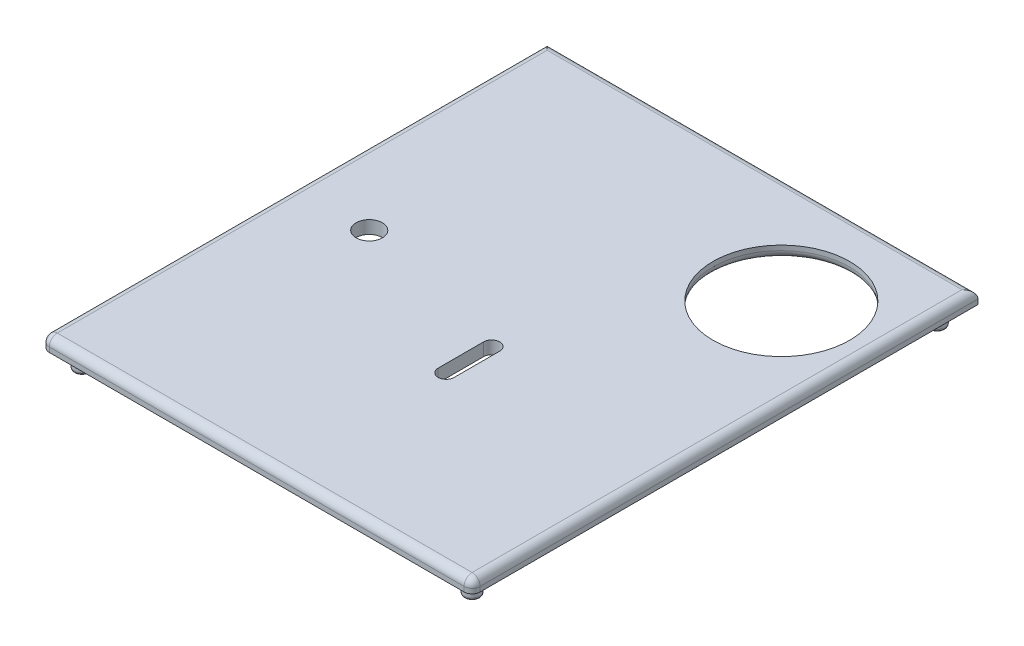
ISO-10303-21;
HEADER;
FILE_DESCRIPTION(('STEP AP214'),'2;1');
FILE_NAME('part.step','',(''),(''),'','','');
FILE_SCHEMA(('AUTOMOTIVE_DESIGN { 1 0 10303 214 1 1 1 1 }'));
ENDSEC;
DATA;
#1=APPLICATION_CONTEXT('core data for automotive mechanical design processes');
#2=APPLICATION_PROTOCOL_DEFINITION('international standard','automotive_design',2000,#1);
#3=PRODUCT_CONTEXT('',#1,'mechanical');
#4=PRODUCT('Part','Part','',(#3));
#5=PRODUCT_RELATED_PRODUCT_CATEGORY('part','',(#4));
#6=PRODUCT_DEFINITION_FORMATION('','',#4);
#7=PRODUCT_DEFINITION_CONTEXT('part definition',#1,'design');
#8=PRODUCT_DEFINITION('design','',#6,#7);
#9=PRODUCT_DEFINITION_SHAPE('','',#8);
#10=(LENGTH_UNIT() NAMED_UNIT(*) SI_UNIT(.MILLI.,.METRE.));
#11=(NAMED_UNIT(*) PLANE_ANGLE_UNIT() SI_UNIT($,.RADIAN.));
#12=(NAMED_UNIT(*) SI_UNIT($,.STERADIAN.) SOLID_ANGLE_UNIT());
#13=UNCERTAINTY_MEASURE_WITH_UNIT(LENGTH_MEASURE(1.E-05),#10,'distance_accuracy_value','');
#14=(GEOMETRIC_REPRESENTATION_CONTEXT(3) GLOBAL_UNCERTAINTY_ASSIGNED_CONTEXT((#13)) GLOBAL_UNIT_ASSIGNED_CONTEXT((#10,
#11,#12)) REPRESENTATION_CONTEXT('',''));
#15=CARTESIAN_POINT('',(0.,0.,0.));
#16=DIRECTION('',(0.,0.,1.));
#17=DIRECTION('',(1.,0.,0.));
#18=AXIS2_PLACEMENT_3D('',#15,#16,#17);
#19=CARTESIAN_POINT('',(0.,0.,0.));
#20=DIRECTION('',(0.,1.,0.));
#21=DIRECTION('',(0.,0.,1.));
#22=AXIS2_PLACEMENT_3D('',#19,#20,#21);
#23=PLANE('',#22);
#24=DIRECTION('',(0.,0.,-1.));
#25=VECTOR('',#24,1.);
#26=CARTESIAN_POINT('',(5.5,0.,0.));
#27=LINE('',#26,#25);
#28=CARTESIAN_POINT('',(5.5,0.,15.85));
#29=VERTEX_POINT('',#28);
#30=CARTESIAN_POINT('',(5.5,0.,7.35));
#31=VERTEX_POINT('',#30);
#32=EDGE_CURVE('E282',#29,#31,#27,.T.);
#33=ORIENTED_EDGE('',*,*,#32,.T.);
#34=CARTESIAN_POINT('',(4.,0.,7.35000000000001));
#35=DIRECTION('',(0.,1.,0.));
#36=DIRECTION('',(0.,0.,1.));
#37=AXIS2_PLACEMENT_3D('',#34,#35,#36);
#38=CIRCLE('',#37,1.5);
#39=CARTESIAN_POINT('',(2.5,0.,7.35));
#40=VERTEX_POINT('',#39);
#41=EDGE_CURVE('E92',#31,#40,#38,.T.);
#42=ORIENTED_EDGE('',*,*,#41,.T.);
#43=DIRECTION('',(0.,0.,1.));
#44=VECTOR('',#43,1.);
#45=CARTESIAN_POINT('',(2.5,0.,0.));
#46=LINE('',#45,#44);
#47=CARTESIAN_POINT('',(2.5,0.,15.85));
#48=VERTEX_POINT('',#47);
#49=EDGE_CURVE('E292',#40,#48,#46,.T.);
#50=ORIENTED_EDGE('',*,*,#49,.T.);
#51=CARTESIAN_POINT('',(4.,0.,15.85));
#52=DIRECTION('',(0.,1.,0.));
#53=DIRECTION('',(0.,0.,1.));
#54=AXIS2_PLACEMENT_3D('',#51,#52,#53);
#55=CIRCLE('',#54,1.5);
#56=EDGE_CURVE('E296',#48,#29,#55,.T.);
#57=ORIENTED_EDGE('',*,*,#56,.T.);
#58=EDGE_LOOP('',(#33,#42,#50,#57));
#59=FACE_BOUND('',#58,.T.);
#60=CARTESIAN_POINT('',(36.4,0.,43.4));
#61=DIRECTION('',(0.,1.,0.));
#62=DIRECTION('',(0.,0.,1.));
#63=AXIS2_PLACEMENT_3D('',#60,#61,#62);
#64=CIRCLE('',#63,1.45);
#65=CARTESIAN_POINT('',(36.4,0.,44.85));
#66=VERTEX_POINT('',#65);
#67=EDGE_CURVE('E309',#66,#66,#64,.T.);
#68=ORIENTED_EDGE('',*,*,#67,.T.);
#69=EDGE_LOOP('',(#68));
#70=FACE_BOUND('',#69,.T.);
#71=CARTESIAN_POINT('',(-36.4,0.,43.4));
#72=DIRECTION('',(0.,1.,0.));
#73=DIRECTION('',(0.,0.,1.));
#74=AXIS2_PLACEMENT_3D('',#71,#72,#73);
#75=CIRCLE('',#74,1.45);
#76=CARTESIAN_POINT('',(-36.4,0.,44.85));
#77=VERTEX_POINT('',#76);
#78=EDGE_CURVE('E313',#77,#77,#75,.T.);
#79=ORIENTED_EDGE('',*,*,#78,.T.);
#80=EDGE_LOOP('',(#79));
#81=FACE_BOUND('',#80,.T.);
#82=CARTESIAN_POINT('',(-36.4,0.,-43.4));
#83=DIRECTION('',(0.,1.,0.));
#84=DIRECTION('',(0.,0.,1.));
#85=AXIS2_PLACEMENT_3D('',#82,#83,#84);
#86=CIRCLE('',#85,1.45);
#87=CARTESIAN_POINT('',(-36.4,0.,-41.95));
#88=VERTEX_POINT('',#87);
#89=EDGE_CURVE('E317',#88,#88,#86,.T.);
#90=ORIENTED_EDGE('',*,*,#89,.T.);
#91=EDGE_LOOP('',(#90));
#92=FACE_BOUND('',#91,.T.);
#93=CARTESIAN_POINT('',(36.4,0.,-43.4));
#94=DIRECTION('',(0.,1.,0.));
#95=DIRECTION('',(0.,0.,1.));
#96=AXIS2_PLACEMENT_3D('',#93,#94,#95);
#97=CIRCLE('',#96,1.45);
#98=CARTESIAN_POINT('',(36.4,0.,-41.95));
#99=VERTEX_POINT('',#98);
#100=EDGE_CURVE('E321',#99,#99,#97,.T.);
#101=ORIENTED_EDGE('',*,*,#100,.T.);
#102=EDGE_LOOP('',(#101));
#103=FACE_BOUND('',#102,.T.);
#104=DIRECTION('',(0.,0.,1.));
#105=VECTOR('',#104,1.);
#106=CARTESIAN_POINT('',(37.9,0.,4.20000000000001));
#107=LINE('',#106,#105);
#108=CARTESIAN_POINT('',(37.9,0.,-7.79999999999999));
#109=VERTEX_POINT('',#108);
#110=CARTESIAN_POINT('',(37.9,0.,4.20000000000001));
#111=VERTEX_POINT('',#110);
#112=EDGE_CURVE('E357',#109,#111,#107,.T.);
#113=ORIENTED_EDGE('',*,*,#112,.F.);
#114=DIRECTION('',(1.,0.,0.));
#115=VECTOR('',#114,1.);
#116=CARTESIAN_POINT('',(35.9,0.,-7.79999999999999));
#117=LINE('',#116,#115);
#118=CARTESIAN_POINT('',(35.9,0.,-7.79999999999999));
#119=VERTEX_POINT('',#118);
#120=EDGE_CURVE('E220',#119,#109,#117,.T.);
#121=ORIENTED_EDGE('',*,*,#120,.F.);
#122=DIRECTION('',(0.,0.,-1.));
#123=VECTOR('',#122,1.);
#124=CARTESIAN_POINT('',(35.9,0.,4.20000000000001));
#125=LINE('',#124,#123);
#126=CARTESIAN_POINT('',(35.9,0.,4.20000000000001));
#127=VERTEX_POINT('',#126);
#128=EDGE_CURVE('E381',#127,#119,#125,.T.);
#129=ORIENTED_EDGE('',*,*,#128,.F.);
#130=DIRECTION('',(-1.,0.,0.));
#131=VECTOR('',#130,1.);
#132=CARTESIAN_POINT('',(35.9,0.,4.20000000000001));
#133=LINE('',#132,#131);
#134=EDGE_CURVE('E377',#111,#127,#133,.T.);
#135=ORIENTED_EDGE('',*,*,#134,.F.);
#136=EDGE_LOOP('',(#113,#121,#129,#135));
#137=FACE_BOUND('',#136,.T.);
#138=CARTESIAN_POINT('',(23.65,0.,-27.05));
#139=DIRECTION('',(0.,1.,0.));
#140=DIRECTION('',(0.,0.,1.));
#141=AXIS2_PLACEMENT_3D('',#138,#139,#140);
#142=CIRCLE('',#141,14.25);
#143=CARTESIAN_POINT('',(23.65,0.,-12.8));
#144=VERTEX_POINT('',#143);
#145=EDGE_CURVE('E441',#144,#144,#142,.T.);
#146=ORIENTED_EDGE('',*,*,#145,.T.);
#147=EDGE_LOOP('',(#146));
#148=FACE_BOUND('',#147,.T.);
#149=CARTESIAN_POINT('',(-26.2,0.,0.));
#150=DIRECTION('',(0.,1.,0.));
#151=DIRECTION('',(0.,0.,1.));
#152=AXIS2_PLACEMENT_3D('',#149,#150,#151);
#153=CIRCLE('',#152,2.45);
#154=CARTESIAN_POINT('',(-26.2,0.,2.45));
#155=VERTEX_POINT('',#154);
#156=EDGE_CURVE('E406',#155,#155,#153,.T.);
#157=ORIENTED_EDGE('',*,*,#156,.T.);
#158=EDGE_LOOP('',(#157));
#159=FACE_BOUND('',#158,.T.);
#160=DIRECTION('',(0.,0.,-1.));
#161=VECTOR('',#160,1.);
#162=CARTESIAN_POINT('',(40.2,0.,0.));
#163=LINE('',#162,#161);
#164=CARTESIAN_POINT('',(40.2,0.,45.7));
#165=VERTEX_POINT('',#164);
#166=CARTESIAN_POINT('',(40.2,0.,-47.2));
#167=VERTEX_POINT('',#166);
#168=EDGE_CURVE('E415',#165,#167,#163,.T.);
#169=ORIENTED_EDGE('',*,*,#168,.F.);
#170=CARTESIAN_POINT('',(38.7,0.,45.7));
#171=DIRECTION('',(0.,1.,0.));
#172=DIRECTION('',(0.,0.,1.));
#173=AXIS2_PLACEMENT_3D('',#170,#171,#172);
#174=CIRCLE('',#173,1.5);
#175=CARTESIAN_POINT('',(38.7,0.,47.2));
#176=VERTEX_POINT('',#175);
#177=EDGE_CURVE('E445',#165,#176,#174,.F.);
#178=ORIENTED_EDGE('',*,*,#177,.T.);
#179=DIRECTION('',(1.,0.,0.));
#180=VECTOR('',#179,1.);
#181=CARTESIAN_POINT('',(0.,0.,47.2));
#182=LINE('',#181,#180);
#183=CARTESIAN_POINT('',(-38.7,0.,47.2));
#184=VERTEX_POINT('',#183);
#185=EDGE_CURVE('E410',#184,#176,#182,.T.);
#186=ORIENTED_EDGE('',*,*,#185,.F.);
#187=CARTESIAN_POINT('',(-38.7,0.,45.7));
#188=DIRECTION('',(0.,1.,0.));
#189=DIRECTION('',(0.,0.,1.));
#190=AXIS2_PLACEMENT_3D('',#187,#188,#189);
#191=CIRCLE('',#190,1.5);
#192=CARTESIAN_POINT('',(-40.2,0.,45.7));
#193=VERTEX_POINT('',#192);
#194=EDGE_CURVE('E438',#184,#193,#191,.F.);
#195=ORIENTED_EDGE('',*,*,#194,.T.);
#196=DIRECTION('',(0.,0.,-1.));
#197=VECTOR('',#196,1.);
#198=CARTESIAN_POINT('',(-40.2,0.,0.));
#199=LINE('',#198,#197);
#200=CARTESIAN_POINT('',(-40.2,0.,-47.2));
#201=VERTEX_POINT('',#200);
#202=EDGE_CURVE('E401',#193,#201,#199,.T.);
#203=ORIENTED_EDGE('',*,*,#202,.T.);
#204=DIRECTION('',(1.,0.,0.));
#205=VECTOR('',#204,1.);
#206=CARTESIAN_POINT('',(0.,0.,-47.2));
#207=LINE('',#206,#205);
#208=EDGE_CURVE('E419',#201,#167,#207,.T.);
#209=ORIENTED_EDGE('',*,*,#208,.T.);
#210=EDGE_LOOP('',(#169,#178,#186,#195,#203,#209));
#211=FACE_BOUND('',#210,.T.);
#212=DIRECTION('',(0.,0.,1.));
#213=VECTOR('',#212,1.);
#214=CARTESIAN_POINT('',(-35.9,0.,4.20000000000001));
#215=LINE('',#214,#213);
#216=CARTESIAN_POINT('',(-35.9,0.,-7.79999999999999));
#217=VERTEX_POINT('',#216);
#218=CARTESIAN_POINT('',(-35.9,0.,4.20000000000001));
#219=VERTEX_POINT('',#218);
#220=EDGE_CURVE('E353',#217,#219,#215,.T.);
#221=ORIENTED_EDGE('',*,*,#220,.F.);
#222=DIRECTION('',(1.,0.,0.));
#223=VECTOR('',#222,1.);
#224=CARTESIAN_POINT('',(-35.9,0.,-7.79999999999999));
#225=LINE('',#224,#223);
#226=CARTESIAN_POINT('',(-37.9,0.,-7.79999999999999));
#227=VERTEX_POINT('',#226);
#228=EDGE_CURVE('E340',#227,#217,#225,.T.);
#229=ORIENTED_EDGE('',*,*,#228,.F.);
#230=DIRECTION('',(0.,0.,-1.));
#231=VECTOR('',#230,1.);
#232=CARTESIAN_POINT('',(-37.9,0.,4.20000000000001));
#233=LINE('',#232,#231);
#234=CARTESIAN_POINT('',(-37.9,0.,4.20000000000001));
#235=VERTEX_POINT('',#234);
#236=EDGE_CURVE('E344',#235,#227,#233,.T.);
#237=ORIENTED_EDGE('',*,*,#236,.F.);
#238=DIRECTION('',(-1.,0.,0.));
#239=VECTOR('',#238,1.);
#240=CARTESIAN_POINT('',(-35.9,0.,4.20000000000001));
#241=LINE('',#240,#239);
#242=EDGE_CURVE('E349',#219,#235,#241,.T.);
#243=ORIENTED_EDGE('',*,*,#242,.F.);
#244=EDGE_LOOP('',(#221,#229,#237,#243));
#245=FACE_BOUND('',#244,.T.);
#246=ADVANCED_FACE('F45',(#59,#70,#81,#92,#103,#137,#148,#159,#211,#245),#23,.F.);
#247=CARTESIAN_POINT('',(0.,2.4,47.2));
#248=DIRECTION('',(0.,0.,-1.));
#249=DIRECTION('',(-1.,0.,0.));
#250=AXIS2_PLACEMENT_3D('',#247,#248,#249);
#251=PLANE('',#250);
#252=ORIENTED_EDGE('',*,*,#185,.T.);
#253=DIRECTION('',(0.,-1.,0.));
#254=VECTOR('',#253,1.);
#255=CARTESIAN_POINT('',(38.7,2.4,47.2));
#256=LINE('',#255,#254);
#257=CARTESIAN_POINT('',(38.7,0.9,47.2));
#258=VERTEX_POINT('',#257);
#259=EDGE_CURVE('E454',#176,#258,#256,.F.);
#260=ORIENTED_EDGE('',*,*,#259,.T.);
#261=DIRECTION('',(1.,0.,0.));
#262=VECTOR('',#261,1.);
#263=CARTESIAN_POINT('',(-40.2,0.9,47.2));
#264=LINE('',#263,#262);
#265=CARTESIAN_POINT('',(-38.7,0.9,47.2));
#266=VERTEX_POINT('',#265);
#267=EDGE_CURVE('E448',#258,#266,#264,.F.);
#268=ORIENTED_EDGE('',*,*,#267,.T.);
#269=DIRECTION('',(0.,-1.,0.));
#270=VECTOR('',#269,1.);
#271=CARTESIAN_POINT('',(-38.7,0.,47.2));
#272=LINE('',#271,#270);
#273=EDGE_CURVE('E451',#266,#184,#272,.T.);
#274=ORIENTED_EDGE('',*,*,#273,.T.);
#275=EDGE_LOOP('',(#252,#260,#268,#274));
#276=FACE_BOUND('',#275,.T.);
#277=ADVANCED_FACE('F539',(#276),#251,.F.);
#278=CARTESIAN_POINT('',(40.2,2.4,0.));
#279=DIRECTION('',(-1.,0.,0.));
#280=DIRECTION('',(0.,0.,1.));
#281=AXIS2_PLACEMENT_3D('',#278,#279,#280);
#282=PLANE('',#281);
#283=DIRECTION('',(0.,0.,-1.));
#284=VECTOR('',#283,1.);
#285=CARTESIAN_POINT('',(40.2,0.9,47.2));
#286=LINE('',#285,#284);
#287=CARTESIAN_POINT('',(40.2,0.9,-47.2));
#288=VERTEX_POINT('',#287);
#289=CARTESIAN_POINT('',(40.2,0.9,45.7));
#290=VERTEX_POINT('',#289);
#291=EDGE_CURVE('E431',#288,#290,#286,.F.);
#292=ORIENTED_EDGE('',*,*,#291,.T.);
#293=DIRECTION('',(0.,-1.,0.));
#294=VECTOR('',#293,1.);
#295=CARTESIAN_POINT('',(40.2,2.4,45.7));
#296=LINE('',#295,#294);
#297=EDGE_CURVE('E434',#290,#165,#296,.T.);
#298=ORIENTED_EDGE('',*,*,#297,.T.);
#299=ORIENTED_EDGE('',*,*,#168,.T.);
#300=DIRECTION('',(0.,-1.,0.));
#301=VECTOR('',#300,1.);
#302=CARTESIAN_POINT('',(40.2,2.4,-47.2));
#303=LINE('',#302,#301);
#304=EDGE_CURVE('E428',#288,#167,#303,.T.);
#305=ORIENTED_EDGE('',*,*,#304,.F.);
#306=EDGE_LOOP('',(#292,#298,#299,#305));
#307=FACE_BOUND('',#306,.T.);
#308=ADVANCED_FACE('F608',(#307),#282,.F.);
#309=CARTESIAN_POINT('',(0.,2.4,-47.2));
#310=DIRECTION('',(0.,0.,-1.));
#311=DIRECTION('',(-1.,0.,0.));
#312=AXIS2_PLACEMENT_3D('',#309,#310,#311);
#313=PLANE('',#312);
#314=DIRECTION('',(0.,-1.,0.));
#315=VECTOR('',#314,1.);
#316=CARTESIAN_POINT('',(-40.2,2.4,-47.2));
#317=LINE('',#316,#315);
#318=CARTESIAN_POINT('',(-40.2,0.9,-47.2));
#319=VERTEX_POINT('',#318);
#320=EDGE_CURVE('E405',#319,#201,#317,.T.);
#321=ORIENTED_EDGE('',*,*,#320,.F.);
#322=DIRECTION('',(1.,0.,0.));
#323=VECTOR('',#322,1.);
#324=CARTESIAN_POINT('',(0.,0.9,-47.2));
#325=LINE('',#324,#323);
#326=EDGE_CURVE('E474',#319,#288,#325,.T.);
#327=ORIENTED_EDGE('',*,*,#326,.T.);
#328=ORIENTED_EDGE('',*,*,#304,.T.);
#329=ORIENTED_EDGE('',*,*,#208,.F.);
#330=EDGE_LOOP('',(#321,#327,#328,#329));
#331=FACE_BOUND('',#330,.T.);
#332=ADVANCED_FACE('F604',(#331),#313,.T.);
#333=CARTESIAN_POINT('',(23.65,2.4,-27.05));
#334=DIRECTION('',(0.,-1.,0.));
#335=DIRECTION('',(0.,0.,-1.));
#336=AXIS2_PLACEMENT_3D('',#333,#334,#335);
#337=CYLINDRICAL_SURFACE('',#336,12.75);
#338=CARTESIAN_POINT('',(23.65,1.5,-27.05));
#339=DIRECTION('',(0.,1.,0.));
#340=DIRECTION('',(0.,0.,1.));
#341=AXIS2_PLACEMENT_3D('',#338,#339,#340);
#342=CIRCLE('',#341,12.75);
#343=CARTESIAN_POINT('',(23.65,1.5,-14.3));
#344=VERTEX_POINT('',#343);
#345=EDGE_CURVE('E457',#344,#344,#342,.F.);
#346=ORIENTED_EDGE('',*,*,#345,.T.);
#347=EDGE_LOOP('',(#346));
#348=FACE_BOUND('',#347,.T.);
#349=CARTESIAN_POINT('',(23.65,2.4,-27.05));
#350=DIRECTION('',(0.,1.,0.));
#351=DIRECTION('',(0.,0.,1.));
#352=AXIS2_PLACEMENT_3D('',#349,#350,#351);
#353=CIRCLE('',#352,12.75);
#354=CARTESIAN_POINT('',(23.65,2.4,-14.3));
#355=VERTEX_POINT('',#354);
#356=EDGE_CURVE('E400',#355,#355,#353,.T.);
#357=ORIENTED_EDGE('',*,*,#356,.T.);
#358=EDGE_LOOP('',(#357));
#359=FACE_BOUND('',#358,.T.);
#360=ADVANCED_FACE('F607',(#348,#359),#337,.F.);
#361=CARTESIAN_POINT('',(-26.2,2.4,0.));
#362=DIRECTION('',(0.,-1.,0.));
#363=DIRECTION('',(0.,0.,-1.));
#364=AXIS2_PLACEMENT_3D('',#361,#362,#363);
#365=CYLINDRICAL_SURFACE('',#364,2.45);
#366=CARTESIAN_POINT('',(-26.2,2.4,0.));
#367=DIRECTION('',(0.,1.,0.));
#368=DIRECTION('',(0.,0.,1.));
#369=AXIS2_PLACEMENT_3D('',#366,#367,#368);
#370=CIRCLE('',#369,2.45);
#371=CARTESIAN_POINT('',(-26.2,2.4,2.45));
#372=VERTEX_POINT('',#371);
#373=EDGE_CURVE('E396',#372,#372,#370,.T.);
#374=ORIENTED_EDGE('',*,*,#373,.T.);
#375=EDGE_LOOP('',(#374));
#376=FACE_BOUND('',#375,.T.);
#377=ORIENTED_EDGE('',*,*,#156,.F.);
#378=EDGE_LOOP('',(#377));
#379=FACE_BOUND('',#378,.T.);
#380=ADVANCED_FACE('F602',(#376,#379),#365,.F.);
#381=CARTESIAN_POINT('',(-40.2,2.4,0.));
#382=DIRECTION('',(-1.,0.,0.));
#383=DIRECTION('',(0.,0.,1.));
#384=AXIS2_PLACEMENT_3D('',#381,#382,#383);
#385=PLANE('',#384);
#386=ORIENTED_EDGE('',*,*,#202,.F.);
#387=DIRECTION('',(0.,-1.,0.));
#388=VECTOR('',#387,1.);
#389=CARTESIAN_POINT('',(-40.2,2.4,45.7));
#390=LINE('',#389,#388);
#391=CARTESIAN_POINT('',(-40.2,0.9,45.7));
#392=VERTEX_POINT('',#391);
#393=EDGE_CURVE('E480',#193,#392,#390,.F.);
#394=ORIENTED_EDGE('',*,*,#393,.T.);
#395=DIRECTION('',(0.,0.,-1.));
#396=VECTOR('',#395,1.);
#397=CARTESIAN_POINT('',(-40.2,0.9,0.));
#398=LINE('',#397,#396);
#399=EDGE_CURVE('E477',#392,#319,#398,.T.);
#400=ORIENTED_EDGE('',*,*,#399,.T.);
#401=ORIENTED_EDGE('',*,*,#320,.T.);
#402=EDGE_LOOP('',(#386,#394,#400,#401));
#403=FACE_BOUND('',#402,.T.);
#404=ADVANCED_FACE('F598',(#403),#385,.T.);
#405=CARTESIAN_POINT('',(0.,2.4,0.));
#406=DIRECTION('',(0.,1.,0.));
#407=DIRECTION('',(0.,0.,1.));
#408=AXIS2_PLACEMENT_3D('',#405,#406,#407);
#409=PLANE('',#408);
#410=CARTESIAN_POINT('',(4.,2.4,7.35000000000001));
#411=DIRECTION('',(0.,1.,0.));
#412=DIRECTION('',(0.,0.,1.));
#413=AXIS2_PLACEMENT_3D('',#410,#411,#412);
#414=CIRCLE('',#413,1.5);
#415=CARTESIAN_POINT('',(5.5,2.4,7.35));
#416=VERTEX_POINT('',#415);
#417=CARTESIAN_POINT('',(2.5,2.4,7.35000000000001));
#418=VERTEX_POINT('',#417);
#419=EDGE_CURVE('E11',#416,#418,#414,.T.);
#420=ORIENTED_EDGE('',*,*,#419,.F.);
#421=DIRECTION('',(0.,0.,-1.));
#422=VECTOR('',#421,1.);
#423=CARTESIAN_POINT('',(5.5,2.4,7.35));
#424=LINE('',#423,#422);
#425=CARTESIAN_POINT('',(5.5,2.4,15.85));
#426=VERTEX_POINT('',#425);
#427=EDGE_CURVE('E55',#426,#416,#424,.T.);
#428=ORIENTED_EDGE('',*,*,#427,.F.);
#429=CARTESIAN_POINT('',(4.,2.4,15.85));
#430=DIRECTION('',(0.,1.,0.));
#431=DIRECTION('',(0.,0.,1.));
#432=AXIS2_PLACEMENT_3D('',#429,#430,#431);
#433=CIRCLE('',#432,1.5);
#434=CARTESIAN_POINT('',(2.5,2.4,15.85));
#435=VERTEX_POINT('',#434);
#436=EDGE_CURVE('E268',#435,#426,#433,.T.);
#437=ORIENTED_EDGE('',*,*,#436,.F.);
#438=DIRECTION('',(0.,0.,1.));
#439=VECTOR('',#438,1.);
#440=CARTESIAN_POINT('',(2.5,2.4,7.35));
#441=LINE('',#440,#439);
#442=EDGE_CURVE('E265',#418,#435,#441,.T.);
#443=ORIENTED_EDGE('',*,*,#442,.F.);
#444=EDGE_LOOP('',(#420,#428,#437,#443));
#445=FACE_BOUND('',#444,.T.);
#446=DIRECTION('',(1.,0.,0.));
#447=VECTOR('',#446,1.);
#448=CARTESIAN_POINT('',(40.2,2.4,45.7));
#449=LINE('',#448,#447);
#450=CARTESIAN_POINT('',(-38.7,2.4,45.7));
#451=VERTEX_POINT('',#450);
#452=CARTESIAN_POINT('',(38.7,2.4,45.7));
#453=VERTEX_POINT('',#452);
#454=EDGE_CURVE('E461',#451,#453,#449,.T.);
#455=ORIENTED_EDGE('',*,*,#454,.T.);
#456=DIRECTION('',(0.,0.,-1.));
#457=VECTOR('',#456,1.);
#458=CARTESIAN_POINT('',(38.7,2.4,-47.2));
#459=LINE('',#458,#457);
#460=CARTESIAN_POINT('',(38.7,2.4,-45.7));
#461=VERTEX_POINT('',#460);
#462=EDGE_CURVE('E470',#453,#461,#459,.T.);
#463=ORIENTED_EDGE('',*,*,#462,.T.);
#464=DIRECTION('',(1.,0.,0.));
#465=VECTOR('',#464,1.);
#466=CARTESIAN_POINT('',(0.,2.4,-45.7));
#467=LINE('',#466,#465);
#468=CARTESIAN_POINT('',(-38.7,2.4,-45.7));
#469=VERTEX_POINT('',#468);
#470=EDGE_CURVE('E467',#461,#469,#467,.F.);
#471=ORIENTED_EDGE('',*,*,#470,.T.);
#472=DIRECTION('',(0.,0.,-1.));
#473=VECTOR('',#472,1.);
#474=CARTESIAN_POINT('',(-38.7,2.4,0.));
#475=LINE('',#474,#473);
#476=EDGE_CURVE('E464',#469,#451,#475,.F.);
#477=ORIENTED_EDGE('',*,*,#476,.T.);
#478=EDGE_LOOP('',(#455,#463,#471,#477));
#479=FACE_BOUND('',#478,.T.);
#480=ORIENTED_EDGE('',*,*,#373,.F.);
#481=EDGE_LOOP('',(#480));
#482=FACE_BOUND('',#481,.T.);
#483=ORIENTED_EDGE('',*,*,#356,.F.);
#484=EDGE_LOOP('',(#483));
#485=FACE_BOUND('',#484,.T.);
#486=ADVANCED_FACE('F287',(#445,#479,#482,#485),#409,.T.);
#487=CARTESIAN_POINT('',(-38.7,2.4,45.7));
#488=DIRECTION('',(0.,1.,0.));
#489=DIRECTION('',(0.,0.,1.));
#490=AXIS2_PLACEMENT_3D('',#487,#488,#489);
#491=CYLINDRICAL_SURFACE('',#490,1.5);
#492=ORIENTED_EDGE('',*,*,#194,.F.);
#493=ORIENTED_EDGE('',*,*,#273,.F.);
#494=CARTESIAN_POINT('',(-38.7,0.9,45.7));
#495=DIRECTION('',(0.,1.,0.));
#496=DIRECTION('',(0.,0.,1.));
#497=AXIS2_PLACEMENT_3D('',#494,#495,#496);
#498=CIRCLE('',#497,1.5);
#499=EDGE_CURVE('E411',#392,#266,#498,.T.);
#500=ORIENTED_EDGE('',*,*,#499,.F.);
#501=ORIENTED_EDGE('',*,*,#393,.F.);
#502=EDGE_LOOP('',(#492,#493,#500,#501));
#503=FACE_BOUND('',#502,.T.);
#504=ADVANCED_FACE('F597',(#503),#491,.T.);
#505=CARTESIAN_POINT('',(-38.7,0.9,0.));
#506=DIRECTION('',(0.,0.,-1.));
#507=DIRECTION('',(-1.,0.,0.));
#508=AXIS2_PLACEMENT_3D('',#505,#506,#507);
#509=CYLINDRICAL_SURFACE('',#508,1.5);
#510=CARTESIAN_POINT('',(-38.7,0.9,-45.7));
#511=DIRECTION('',(0.707106781186547,0.,-0.707106781186547));
#512=DIRECTION('',(-0.707106781186547,0.,-0.707106781186547));
#513=AXIS2_PLACEMENT_3D('',#510,#511,#512);
#514=ELLIPSE('',#513,2.12132034355964,1.5);
#515=EDGE_CURVE('E502',#319,#469,#514,.T.);
#516=ORIENTED_EDGE('',*,*,#515,.F.);
#517=ORIENTED_EDGE('',*,*,#399,.F.);
#518=CARTESIAN_POINT('',(-38.7,0.9,45.7));
#519=DIRECTION('',(0.,0.,1.));
#520=DIRECTION('',(1.,0.,0.));
#521=AXIS2_PLACEMENT_3D('',#518,#519,#520);
#522=CIRCLE('',#521,1.5);
#523=EDGE_CURVE('E506',#451,#392,#522,.T.);
#524=ORIENTED_EDGE('',*,*,#523,.F.);
#525=ORIENTED_EDGE('',*,*,#476,.F.);
#526=EDGE_LOOP('',(#516,#517,#524,#525));
#527=FACE_BOUND('',#526,.T.);
#528=ADVANCED_FACE('F645',(#527),#509,.T.);
#529=CARTESIAN_POINT('',(-38.7,0.9,45.7));
#530=DIRECTION('',(-1.,0.,0.));
#531=DIRECTION('',(0.,0.,1.));
#532=AXIS2_PLACEMENT_3D('',#529,#530,#531);
#533=SPHERICAL_SURFACE('',#532,1.5);
#534=ORIENTED_EDGE('',*,*,#523,.T.);
#535=ORIENTED_EDGE('',*,*,#499,.T.);
#536=CARTESIAN_POINT('',(-38.7,0.9,45.7));
#537=DIRECTION('',(-1.,0.,0.));
#538=DIRECTION('',(0.,0.,1.));
#539=AXIS2_PLACEMENT_3D('',#536,#537,#538);
#540=CIRCLE('',#539,1.5);
#541=EDGE_CURVE('E498',#451,#266,#540,.F.);
#542=ORIENTED_EDGE('',*,*,#541,.F.);
#543=EDGE_LOOP('',(#534,#535,#542));
#544=FACE_BOUND('',#543,.T.);
#545=ADVANCED_FACE('F641',(#544),#533,.T.);
#546=CARTESIAN_POINT('',(0.,0.9,-45.7));
#547=DIRECTION('',(1.,0.,0.));
#548=DIRECTION('',(0.,0.,-1.));
#549=AXIS2_PLACEMENT_3D('',#546,#547,#548);
#550=CYLINDRICAL_SURFACE('',#549,1.5);
#551=ORIENTED_EDGE('',*,*,#515,.T.);
#552=ORIENTED_EDGE('',*,*,#470,.F.);
#553=CARTESIAN_POINT('',(38.7,0.9,-45.7));
#554=DIRECTION('',(0.707106781186547,0.,0.707106781186547));
#555=DIRECTION('',(0.707106781186547,0.,-0.707106781186547));
#556=AXIS2_PLACEMENT_3D('',#553,#554,#555);
#557=ELLIPSE('',#556,2.12132034355964,1.5);
#558=EDGE_CURVE('E495',#288,#461,#557,.T.);
#559=ORIENTED_EDGE('',*,*,#558,.F.);
#560=ORIENTED_EDGE('',*,*,#326,.F.);
#561=EDGE_LOOP('',(#551,#552,#559,#560));
#562=FACE_BOUND('',#561,.T.);
#563=ADVANCED_FACE('F637',(#562),#550,.T.);
#564=CARTESIAN_POINT('',(0.,0.9,45.7));
#565=DIRECTION('',(-1.,0.,0.));
#566=DIRECTION('',(0.,0.,1.));
#567=AXIS2_PLACEMENT_3D('',#564,#565,#566);
#568=CYLINDRICAL_SURFACE('',#567,1.5);
#569=ORIENTED_EDGE('',*,*,#541,.T.);
#570=ORIENTED_EDGE('',*,*,#267,.F.);
#571=CARTESIAN_POINT('',(38.7,0.9,45.7));
#572=DIRECTION('',(1.,0.,0.));
#573=DIRECTION('',(0.,0.,-1.));
#574=AXIS2_PLACEMENT_3D('',#571,#572,#573);
#575=CIRCLE('',#574,1.5);
#576=EDGE_CURVE('E491',#453,#258,#575,.T.);
#577=ORIENTED_EDGE('',*,*,#576,.F.);
#578=ORIENTED_EDGE('',*,*,#454,.F.);
#579=EDGE_LOOP('',(#569,#570,#577,#578));
#580=FACE_BOUND('',#579,.T.);
#581=ADVANCED_FACE('F633',(#580),#568,.T.);
#582=CARTESIAN_POINT('',(38.7,0.9,0.));
#583=DIRECTION('',(0.,0.,1.));
#584=DIRECTION('',(1.,0.,0.));
#585=AXIS2_PLACEMENT_3D('',#582,#583,#584);
#586=CYLINDRICAL_SURFACE('',#585,1.5);
#587=ORIENTED_EDGE('',*,*,#558,.T.);
#588=ORIENTED_EDGE('',*,*,#462,.F.);
#589=CARTESIAN_POINT('',(38.7,0.9,45.7));
#590=DIRECTION('',(0.,0.,1.));
#591=DIRECTION('',(1.,0.,0.));
#592=AXIS2_PLACEMENT_3D('',#589,#590,#591);
#593=CIRCLE('',#592,1.5);
#594=EDGE_CURVE('E487',#290,#453,#593,.T.);
#595=ORIENTED_EDGE('',*,*,#594,.F.);
#596=ORIENTED_EDGE('',*,*,#291,.F.);
#597=EDGE_LOOP('',(#587,#588,#595,#596));
#598=FACE_BOUND('',#597,.T.);
#599=ADVANCED_FACE('F629',(#598),#586,.T.);
#600=CARTESIAN_POINT('',(38.7,0.9,45.7));
#601=DIRECTION('',(0.,1.,0.));
#602=DIRECTION('',(0.,0.,1.));
#603=AXIS2_PLACEMENT_3D('',#600,#601,#602);
#604=SPHERICAL_SURFACE('',#603,1.5);
#605=ORIENTED_EDGE('',*,*,#594,.T.);
#606=ORIENTED_EDGE('',*,*,#576,.T.);
#607=CARTESIAN_POINT('',(38.7,0.9,45.7));
#608=DIRECTION('',(0.,1.,0.));
#609=DIRECTION('',(0.,0.,1.));
#610=AXIS2_PLACEMENT_3D('',#607,#608,#609);
#611=CIRCLE('',#610,1.5);
#612=EDGE_CURVE('E395',#290,#258,#611,.F.);
#613=ORIENTED_EDGE('',*,*,#612,.F.);
#614=EDGE_LOOP('',(#605,#606,#613));
#615=FACE_BOUND('',#614,.T.);
#616=ADVANCED_FACE('F625',(#615),#604,.T.);
#617=CARTESIAN_POINT('',(38.7,2.4,45.7));
#618=DIRECTION('',(0.,-1.,0.));
#619=DIRECTION('',(0.,0.,-1.));
#620=AXIS2_PLACEMENT_3D('',#617,#618,#619);
#621=CYLINDRICAL_SURFACE('',#620,1.5);
#622=ORIENTED_EDGE('',*,*,#612,.T.);
#623=ORIENTED_EDGE('',*,*,#259,.F.);
#624=ORIENTED_EDGE('',*,*,#177,.F.);
#625=ORIENTED_EDGE('',*,*,#297,.F.);
#626=EDGE_LOOP('',(#622,#623,#624,#625));
#627=FACE_BOUND('',#626,.T.);
#628=ADVANCED_FACE('F622',(#627),#621,.T.);
#629=CARTESIAN_POINT('',(23.65,1.5,-27.05));
#630=DIRECTION('',(0.,1.,0.));
#631=DIRECTION('',(0.,0.,1.));
#632=AXIS2_PLACEMENT_3D('',#629,#630,#631);
#633=TOROIDAL_SURFACE('',#632,14.25,1.5);
#634=ORIENTED_EDGE('',*,*,#345,.F.);
#635=EDGE_LOOP('',(#634));
#636=FACE_BOUND('',#635,.T.);
#637=ORIENTED_EDGE('',*,*,#145,.F.);
#638=EDGE_LOOP('',(#637));
#639=FACE_BOUND('',#638,.T.);
#640=ADVANCED_FACE('F595',(#636,#639),#633,.T.);
#641=CARTESIAN_POINT('',(37.9,-2.6,4.20000000000001));
#642=DIRECTION('',(-1.,0.,0.));
#643=DIRECTION('',(0.,0.,1.));
#644=AXIS2_PLACEMENT_3D('',#641,#642,#643);
#645=PLANE('',#644);
#646=DIRECTION('',(0.,1.,0.));
#647=VECTOR('',#646,1.);
#648=CARTESIAN_POINT('',(37.9,-2.6,4.20000000000001));
#649=LINE('',#648,#647);
#650=CARTESIAN_POINT('',(37.9,-2.1,4.20000000000001));
#651=VERTEX_POINT('',#650);
#652=EDGE_CURVE('E208',#651,#111,#649,.T.);
#653=ORIENTED_EDGE('',*,*,#652,.F.);
#654=DIRECTION('',(0.,0.,1.));
#655=VECTOR('',#654,1.);
#656=CARTESIAN_POINT('',(37.9,-2.1,-7.79999999999999));
#657=LINE('',#656,#655);
#658=CARTESIAN_POINT('',(37.9,-2.1,-7.79999999999999));
#659=VERTEX_POINT('',#658);
#660=EDGE_CURVE('E202',#651,#659,#657,.F.);
#661=ORIENTED_EDGE('',*,*,#660,.T.);
#662=DIRECTION('',(0.,1.,0.));
#663=VECTOR('',#662,1.);
#664=CARTESIAN_POINT('',(37.9,-2.6,-7.79999999999999));
#665=LINE('',#664,#663);
#666=EDGE_CURVE('E206',#659,#109,#665,.T.);
#667=ORIENTED_EDGE('',*,*,#666,.T.);
#668=ORIENTED_EDGE('',*,*,#112,.T.);
#669=EDGE_LOOP('',(#653,#661,#667,#668));
#670=FACE_BOUND('',#669,.T.);
#671=ADVANCED_FACE('F204',(#670),#645,.F.);
#672=CARTESIAN_POINT('',(35.9,-2.6,4.20000000000001));
#673=DIRECTION('',(0.,0.,-1.));
#674=DIRECTION('',(-1.,0.,0.));
#675=AXIS2_PLACEMENT_3D('',#672,#673,#674);
#676=PLANE('',#675);
#677=DIRECTION('',(-1.,0.,0.));
#678=VECTOR('',#677,1.);
#679=CARTESIAN_POINT('',(35.9,-2.6,4.20000000000001));
#680=LINE('',#679,#678);
#681=CARTESIAN_POINT('',(37.4,-2.6,4.20000000000001));
#682=VERTEX_POINT('',#681);
#683=CARTESIAN_POINT('',(35.9,-2.6,4.20000000000001));
#684=VERTEX_POINT('',#683);
#685=EDGE_CURVE('E367',#682,#684,#680,.T.);
#686=ORIENTED_EDGE('',*,*,#685,.F.);
#687=CARTESIAN_POINT('',(37.4,-2.1,4.20000000000001));
#688=DIRECTION('',(0.,0.,-1.));
#689=DIRECTION('',(-1.,0.,0.));
#690=AXIS2_PLACEMENT_3D('',#687,#688,#689);
#691=CIRCLE('',#690,0.5);
#692=EDGE_CURVE('E197',#682,#651,#691,.F.);
#693=ORIENTED_EDGE('',*,*,#692,.T.);
#694=ORIENTED_EDGE('',*,*,#652,.T.);
#695=ORIENTED_EDGE('',*,*,#134,.T.);
#696=DIRECTION('',(0.,1.,0.));
#697=VECTOR('',#696,1.);
#698=CARTESIAN_POINT('',(35.9,-2.6,4.20000000000001));
#699=LINE('',#698,#697);
#700=EDGE_CURVE('E389',#684,#127,#699,.T.);
#701=ORIENTED_EDGE('',*,*,#700,.F.);
#702=EDGE_LOOP('',(#686,#693,#694,#695,#701));
#703=FACE_BOUND('',#702,.T.);
#704=ADVANCED_FACE('F530',(#703),#676,.F.);
#705=CARTESIAN_POINT('',(35.9,-2.6,4.20000000000001));
#706=DIRECTION('',(1.,0.,0.));
#707=DIRECTION('',(0.,0.,-1.));
#708=AXIS2_PLACEMENT_3D('',#705,#706,#707);
#709=PLANE('',#708);
#710=ORIENTED_EDGE('',*,*,#128,.T.);
#711=DIRECTION('',(0.,1.,0.));
#712=VECTOR('',#711,1.);
#713=CARTESIAN_POINT('',(35.9,-2.6,-7.79999999999999));
#714=LINE('',#713,#712);
#715=CARTESIAN_POINT('',(35.9,-2.6,-7.79999999999999));
#716=VERTEX_POINT('',#715);
#717=EDGE_CURVE('E222',#716,#119,#714,.T.);
#718=ORIENTED_EDGE('',*,*,#717,.F.);
#719=DIRECTION('',(0.,0.,-1.));
#720=VECTOR('',#719,1.);
#721=CARTESIAN_POINT('',(35.9,-2.6,4.20000000000001));
#722=LINE('',#721,#720);
#723=EDGE_CURVE('E370',#684,#716,#722,.T.);
#724=ORIENTED_EDGE('',*,*,#723,.F.);
#725=ORIENTED_EDGE('',*,*,#700,.T.);
#726=EDGE_LOOP('',(#710,#718,#724,#725));
#727=FACE_BOUND('',#726,.T.);
#728=ADVANCED_FACE('F535',(#727),#709,.F.);
#729=CARTESIAN_POINT('',(35.9,-2.6,-7.79999999999999));
#730=DIRECTION('',(0.,0.,1.));
#731=DIRECTION('',(1.,0.,0.));
#732=AXIS2_PLACEMENT_3D('',#729,#730,#731);
#733=PLANE('',#732);
#734=ORIENTED_EDGE('',*,*,#666,.F.);
#735=CARTESIAN_POINT('',(37.4,-2.1,-7.79999999999999));
#736=DIRECTION('',(0.,0.,1.));
#737=DIRECTION('',(1.,0.,0.));
#738=AXIS2_PLACEMENT_3D('',#735,#736,#737);
#739=CIRCLE('',#738,0.5);
#740=CARTESIAN_POINT('',(37.4,-2.6,-7.79999999999999));
#741=VERTEX_POINT('',#740);
#742=EDGE_CURVE('E212',#659,#741,#739,.F.);
#743=ORIENTED_EDGE('',*,*,#742,.T.);
#744=DIRECTION('',(1.,0.,0.));
#745=VECTOR('',#744,1.);
#746=CARTESIAN_POINT('',(35.9,-2.6,-7.79999999999999));
#747=LINE('',#746,#745);
#748=EDGE_CURVE('E223',#716,#741,#747,.T.);
#749=ORIENTED_EDGE('',*,*,#748,.F.);
#750=ORIENTED_EDGE('',*,*,#717,.T.);
#751=ORIENTED_EDGE('',*,*,#120,.T.);
#752=EDGE_LOOP('',(#734,#743,#749,#750,#751));
#753=FACE_BOUND('',#752,.T.);
#754=ADVANCED_FACE('F216',(#753),#733,.F.);
#755=CARTESIAN_POINT('',(0.,-2.6,0.));
#756=DIRECTION('',(0.,-1.,0.));
#757=DIRECTION('',(0.,0.,-1.));
#758=AXIS2_PLACEMENT_3D('',#755,#756,#757);
#759=PLANE('',#758);
#760=ORIENTED_EDGE('',*,*,#748,.T.);
#761=DIRECTION('',(0.,0.,1.));
#762=VECTOR('',#761,1.);
#763=CARTESIAN_POINT('',(37.4,-2.6,4.20000000000001));
#764=LINE('',#763,#762);
#765=EDGE_CURVE('E228',#741,#682,#764,.T.);
#766=ORIENTED_EDGE('',*,*,#765,.T.);
#767=ORIENTED_EDGE('',*,*,#685,.T.);
#768=ORIENTED_EDGE('',*,*,#723,.T.);
#769=EDGE_LOOP('',(#760,#766,#767,#768));
#770=FACE_BOUND('',#769,.T.);
#771=ADVANCED_FACE('F528',(#770),#759,.T.);
#772=CARTESIAN_POINT('',(-35.9,-2.6,4.20000000000001));
#773=DIRECTION('',(-1.,0.,0.));
#774=DIRECTION('',(0.,0.,1.));
#775=AXIS2_PLACEMENT_3D('',#772,#773,#774);
#776=PLANE('',#775);
#777=ORIENTED_EDGE('',*,*,#220,.T.);
#778=DIRECTION('',(0.,1.,0.));
#779=VECTOR('',#778,1.);
#780=CARTESIAN_POINT('',(-35.9,-2.6,4.20000000000001));
#781=LINE('',#780,#779);
#782=CARTESIAN_POINT('',(-35.9,-2.6,4.20000000000001));
#783=VERTEX_POINT('',#782);
#784=EDGE_CURVE('E325',#783,#219,#781,.T.);
#785=ORIENTED_EDGE('',*,*,#784,.F.);
#786=DIRECTION('',(0.,0.,1.));
#787=VECTOR('',#786,1.);
#788=CARTESIAN_POINT('',(-35.9,-2.6,4.20000000000001));
#789=LINE('',#788,#787);
#790=CARTESIAN_POINT('',(-35.9,-2.6,-7.79999999999999));
#791=VERTEX_POINT('',#790);
#792=EDGE_CURVE('E345',#791,#783,#789,.T.);
#793=ORIENTED_EDGE('',*,*,#792,.F.);
#794=DIRECTION('',(0.,1.,0.));
#795=VECTOR('',#794,1.);
#796=CARTESIAN_POINT('',(-35.9,-2.6,-7.79999999999999));
#797=LINE('',#796,#795);
#798=EDGE_CURVE('E335',#791,#217,#797,.T.);
#799=ORIENTED_EDGE('',*,*,#798,.T.);
#800=EDGE_LOOP('',(#777,#785,#793,#799));
#801=FACE_BOUND('',#800,.T.);
#802=ADVANCED_FACE('F558',(#801),#776,.F.);
#803=CARTESIAN_POINT('',(-35.9,-2.6,4.20000000000001));
#804=DIRECTION('',(0.,0.,-1.));
#805=DIRECTION('',(-1.,0.,0.));
#806=AXIS2_PLACEMENT_3D('',#803,#804,#805);
#807=PLANE('',#806);
#808=DIRECTION('',(0.,1.,0.));
#809=VECTOR('',#808,1.);
#810=CARTESIAN_POINT('',(-37.9,-2.6,4.20000000000001));
#811=LINE('',#810,#809);
#812=CARTESIAN_POINT('',(-37.9,-2.1,4.20000000000001));
#813=VERTEX_POINT('',#812);
#814=EDGE_CURVE('E329',#813,#235,#811,.T.);
#815=ORIENTED_EDGE('',*,*,#814,.F.);
#816=CARTESIAN_POINT('',(-37.4,-2.1,4.20000000000001));
#817=DIRECTION('',(0.,0.,-1.));
#818=DIRECTION('',(-1.,0.,0.));
#819=AXIS2_PLACEMENT_3D('',#816,#817,#818);
#820=CIRCLE('',#819,0.5);
#821=CARTESIAN_POINT('',(-37.4,-2.6,4.20000000000001));
#822=VERTEX_POINT('',#821);
#823=EDGE_CURVE('E522',#813,#822,#820,.F.);
#824=ORIENTED_EDGE('',*,*,#823,.T.);
#825=DIRECTION('',(-1.,0.,0.));
#826=VECTOR('',#825,1.);
#827=CARTESIAN_POINT('',(-35.9,-2.6,4.20000000000001));
#828=LINE('',#827,#826);
#829=EDGE_CURVE('E360',#783,#822,#828,.T.);
#830=ORIENTED_EDGE('',*,*,#829,.F.);
#831=ORIENTED_EDGE('',*,*,#784,.T.);
#832=ORIENTED_EDGE('',*,*,#242,.T.);
#833=EDGE_LOOP('',(#815,#824,#830,#831,#832));
#834=FACE_BOUND('',#833,.T.);
#835=ADVANCED_FACE('F570',(#834),#807,.F.);
#836=CARTESIAN_POINT('',(-37.9,-2.6,4.20000000000001));
#837=DIRECTION('',(1.,0.,0.));
#838=DIRECTION('',(0.,0.,-1.));
#839=AXIS2_PLACEMENT_3D('',#836,#837,#838);
#840=PLANE('',#839);
#841=DIRECTION('',(0.,1.,0.));
#842=VECTOR('',#841,1.);
#843=CARTESIAN_POINT('',(-37.9,-2.6,-7.79999999999999));
#844=LINE('',#843,#842);
#845=CARTESIAN_POINT('',(-37.9,-2.1,-7.79999999999999));
#846=VERTEX_POINT('',#845);
#847=EDGE_CURVE('E332',#846,#227,#844,.T.);
#848=ORIENTED_EDGE('',*,*,#847,.F.);
#849=DIRECTION('',(0.,0.,-1.));
#850=VECTOR('',#849,1.);
#851=CARTESIAN_POINT('',(-37.9,-2.1,4.20000000000001));
#852=LINE('',#851,#850);
#853=EDGE_CURVE('E519',#846,#813,#852,.F.);
#854=ORIENTED_EDGE('',*,*,#853,.T.);
#855=ORIENTED_EDGE('',*,*,#814,.T.);
#856=ORIENTED_EDGE('',*,*,#236,.T.);
#857=EDGE_LOOP('',(#848,#854,#855,#856));
#858=FACE_BOUND('',#857,.T.);
#859=ADVANCED_FACE('F565',(#858),#840,.F.);
#860=CARTESIAN_POINT('',(-35.9,-2.6,-7.79999999999999));
#861=DIRECTION('',(0.,0.,1.));
#862=DIRECTION('',(1.,0.,0.));
#863=AXIS2_PLACEMENT_3D('',#860,#861,#862);
#864=PLANE('',#863);
#865=DIRECTION('',(1.,0.,0.));
#866=VECTOR('',#865,1.);
#867=CARTESIAN_POINT('',(-35.9,-2.6,-7.79999999999999));
#868=LINE('',#867,#866);
#869=CARTESIAN_POINT('',(-37.4,-2.6,-7.79999999999999));
#870=VERTEX_POINT('',#869);
#871=EDGE_CURVE('E339',#870,#791,#868,.T.);
#872=ORIENTED_EDGE('',*,*,#871,.F.);
#873=CARTESIAN_POINT('',(-37.4,-2.1,-7.79999999999999));
#874=DIRECTION('',(0.,0.,1.));
#875=DIRECTION('',(1.,0.,0.));
#876=AXIS2_PLACEMENT_3D('',#873,#874,#875);
#877=CIRCLE('',#876,0.5);
#878=EDGE_CURVE('E516',#870,#846,#877,.F.);
#879=ORIENTED_EDGE('',*,*,#878,.T.);
#880=ORIENTED_EDGE('',*,*,#847,.T.);
#881=ORIENTED_EDGE('',*,*,#228,.T.);
#882=ORIENTED_EDGE('',*,*,#798,.F.);
#883=EDGE_LOOP('',(#872,#879,#880,#881,#882));
#884=FACE_BOUND('',#883,.T.);
#885=ADVANCED_FACE('F555',(#884),#864,.F.);
#886=CARTESIAN_POINT('',(0.,-2.6,0.));
#887=DIRECTION('',(0.,1.,0.));
#888=DIRECTION('',(0.,0.,1.));
#889=AXIS2_PLACEMENT_3D('',#886,#887,#888);
#890=PLANE('',#889);
#891=ORIENTED_EDGE('',*,*,#829,.T.);
#892=DIRECTION('',(0.,0.,-1.));
#893=VECTOR('',#892,1.);
#894=CARTESIAN_POINT('',(-37.4,-2.6,0.));
#895=LINE('',#894,#893);
#896=EDGE_CURVE('E483',#822,#870,#895,.T.);
#897=ORIENTED_EDGE('',*,*,#896,.T.);
#898=ORIENTED_EDGE('',*,*,#871,.T.);
#899=ORIENTED_EDGE('',*,*,#792,.T.);
#900=EDGE_LOOP('',(#891,#897,#898,#899));
#901=FACE_BOUND('',#900,.T.);
#902=ADVANCED_FACE('F560',(#901),#890,.F.);
#903=CARTESIAN_POINT('',(-37.4,-2.1,0.));
#904=DIRECTION('',(0.,0.,-1.));
#905=DIRECTION('',(-1.,0.,0.));
#906=AXIS2_PLACEMENT_3D('',#903,#904,#905);
#907=CYLINDRICAL_SURFACE('',#906,0.5);
#908=ORIENTED_EDGE('',*,*,#823,.F.);
#909=ORIENTED_EDGE('',*,*,#853,.F.);
#910=ORIENTED_EDGE('',*,*,#878,.F.);
#911=ORIENTED_EDGE('',*,*,#896,.F.);
#912=EDGE_LOOP('',(#908,#909,#910,#911));
#913=FACE_BOUND('',#912,.T.);
#914=ADVANCED_FACE('F568',(#913),#907,.T.);
#915=CARTESIAN_POINT('',(37.4,-2.1,0.));
#916=DIRECTION('',(0.,0.,-1.));
#917=DIRECTION('',(-1.,0.,0.));
#918=AXIS2_PLACEMENT_3D('',#915,#916,#917);
#919=CYLINDRICAL_SURFACE('',#918,0.5);
#920=ORIENTED_EDGE('',*,*,#742,.F.);
#921=ORIENTED_EDGE('',*,*,#660,.F.);
#922=ORIENTED_EDGE('',*,*,#692,.F.);
#923=ORIENTED_EDGE('',*,*,#765,.F.);
#924=EDGE_LOOP('',(#920,#921,#922,#923));
#925=FACE_BOUND('',#924,.T.);
#926=ADVANCED_FACE('F226',(#925),#919,.T.);
#927=CARTESIAN_POINT('',(36.4,-3.5,-43.4));
#928=DIRECTION('',(0.,1.,0.));
#929=DIRECTION('',(0.,0.,1.));
#930=AXIS2_PLACEMENT_3D('',#927,#928,#929);
#931=CYLINDRICAL_SURFACE('',#930,1.45);
#932=CARTESIAN_POINT('',(36.4,-3.,-43.4));
#933=DIRECTION('',(0.,1.,0.));
#934=DIRECTION('',(0.,0.,1.));
#935=AXIS2_PLACEMENT_3D('',#932,#933,#934);
#936=CIRCLE('',#935,1.45);
#937=CARTESIAN_POINT('',(36.4,-3.,-41.95));
#938=VERTEX_POINT('',#937);
#939=EDGE_CURVE('E230',#938,#938,#936,.T.);
#940=ORIENTED_EDGE('',*,*,#939,.T.);
#941=EDGE_LOOP('',(#940));
#942=FACE_BOUND('',#941,.T.);
#943=ORIENTED_EDGE('',*,*,#100,.F.);
#944=EDGE_LOOP('',(#943));
#945=FACE_BOUND('',#944,.T.);
#946=ADVANCED_FACE('F660',(#942,#945),#931,.T.);
#947=CARTESIAN_POINT('',(36.4,-3.5,-43.4));
#948=DIRECTION('',(0.,1.,0.));
#949=DIRECTION('',(0.,0.,1.));
#950=AXIS2_PLACEMENT_3D('',#947,#948,#949);
#951=PLANE('',#950);
#952=CARTESIAN_POINT('',(36.4,-3.5,-43.4));
#953=DIRECTION('',(0.,1.,0.));
#954=DIRECTION('',(0.,0.,1.));
#955=AXIS2_PLACEMENT_3D('',#952,#953,#954);
#956=CIRCLE('',#955,0.95);
#957=CARTESIAN_POINT('',(36.4,-3.5,-42.45));
#958=VERTEX_POINT('',#957);
#959=EDGE_CURVE('E234',#958,#958,#956,.F.);
#960=ORIENTED_EDGE('',*,*,#959,.T.);
#961=EDGE_LOOP('',(#960));
#962=FACE_BOUND('',#961,.T.);
#963=ADVANCED_FACE('F694',(#962),#951,.F.);
#964=CARTESIAN_POINT('',(-36.4,-3.5,-43.4));
#965=DIRECTION('',(0.,1.,0.));
#966=DIRECTION('',(0.,0.,1.));
#967=AXIS2_PLACEMENT_3D('',#964,#965,#966);
#968=CYLINDRICAL_SURFACE('',#967,1.45);
#969=CARTESIAN_POINT('',(-36.4,-3.,-43.4));
#970=DIRECTION('',(0.,1.,0.));
#971=DIRECTION('',(0.,0.,1.));
#972=AXIS2_PLACEMENT_3D('',#969,#970,#971);
#973=CIRCLE('',#972,1.45);
#974=CARTESIAN_POINT('',(-36.4,-3.,-41.95));
#975=VERTEX_POINT('',#974);
#976=EDGE_CURVE('E241',#975,#975,#973,.T.);
#977=ORIENTED_EDGE('',*,*,#976,.T.);
#978=EDGE_LOOP('',(#977));
#979=FACE_BOUND('',#978,.T.);
#980=ORIENTED_EDGE('',*,*,#89,.F.);
#981=EDGE_LOOP('',(#980));
#982=FACE_BOUND('',#981,.T.);
#983=ADVANCED_FACE('F699',(#979,#982),#968,.T.);
#984=CARTESIAN_POINT('',(-36.4,-3.5,-43.4));
#985=DIRECTION('',(0.,1.,0.));
#986=DIRECTION('',(0.,0.,1.));
#987=AXIS2_PLACEMENT_3D('',#984,#985,#986);
#988=PLANE('',#987);
#989=CARTESIAN_POINT('',(-36.4,-3.5,-43.4));
#990=DIRECTION('',(0.,1.,0.));
#991=DIRECTION('',(0.,0.,1.));
#992=AXIS2_PLACEMENT_3D('',#989,#990,#991);
#993=CIRCLE('',#992,0.95);
#994=CARTESIAN_POINT('',(-36.4,-3.5,-42.45));
#995=VERTEX_POINT('',#994);
#996=EDGE_CURVE('E245',#995,#995,#993,.F.);
#997=ORIENTED_EDGE('',*,*,#996,.T.);
#998=EDGE_LOOP('',(#997));
#999=FACE_BOUND('',#998,.T.);
#1000=ADVANCED_FACE('F684',(#999),#988,.F.);
#1001=CARTESIAN_POINT('',(-36.4,-3.5,43.4));
#1002=DIRECTION('',(0.,1.,0.));
#1003=DIRECTION('',(0.,0.,1.));
#1004=AXIS2_PLACEMENT_3D('',#1001,#1002,#1003);
#1005=CYLINDRICAL_SURFACE('',#1004,1.45);
#1006=CARTESIAN_POINT('',(-36.4,-3.,43.4));
#1007=DIRECTION('',(0.,1.,0.));
#1008=DIRECTION('',(0.,0.,1.));
#1009=AXIS2_PLACEMENT_3D('',#1006,#1007,#1008);
#1010=CIRCLE('',#1009,1.45);
#1011=CARTESIAN_POINT('',(-36.4,-3.,44.85));
#1012=VERTEX_POINT('',#1011);
#1013=EDGE_CURVE('E249',#1012,#1012,#1010,.T.);
#1014=ORIENTED_EDGE('',*,*,#1013,.T.);
#1015=EDGE_LOOP('',(#1014));
#1016=FACE_BOUND('',#1015,.T.);
#1017=ORIENTED_EDGE('',*,*,#78,.F.);
#1018=EDGE_LOOP('',(#1017));
#1019=FACE_BOUND('',#1018,.T.);
#1020=ADVANCED_FACE('F680',(#1016,#1019),#1005,.T.);
#1021=CARTESIAN_POINT('',(-36.4,-3.5,43.4));
#1022=DIRECTION('',(0.,1.,0.));
#1023=DIRECTION('',(0.,0.,1.));
#1024=AXIS2_PLACEMENT_3D('',#1021,#1022,#1023);
#1025=PLANE('',#1024);
#1026=CARTESIAN_POINT('',(-36.4,-3.5,43.4));
#1027=DIRECTION('',(0.,1.,0.));
#1028=DIRECTION('',(0.,0.,1.));
#1029=AXIS2_PLACEMENT_3D('',#1026,#1027,#1028);
#1030=CIRCLE('',#1029,0.95);
#1031=CARTESIAN_POINT('',(-36.4,-3.5,44.35));
#1032=VERTEX_POINT('',#1031);
#1033=EDGE_CURVE('E253',#1032,#1032,#1030,.F.);
#1034=ORIENTED_EDGE('',*,*,#1033,.T.);
#1035=EDGE_LOOP('',(#1034));
#1036=FACE_BOUND('',#1035,.T.);
#1037=ADVANCED_FACE('F683',(#1036),#1025,.F.);
#1038=CARTESIAN_POINT('',(36.4,-3.5,43.4));
#1039=DIRECTION('',(0.,1.,0.));
#1040=DIRECTION('',(0.,0.,1.));
#1041=AXIS2_PLACEMENT_3D('',#1038,#1039,#1040);
#1042=CYLINDRICAL_SURFACE('',#1041,1.45);
#1043=CARTESIAN_POINT('',(36.4,-3.,43.4));
#1044=DIRECTION('',(0.,1.,0.));
#1045=DIRECTION('',(0.,0.,1.));
#1046=AXIS2_PLACEMENT_3D('',#1043,#1044,#1045);
#1047=CIRCLE('',#1046,1.45);
#1048=CARTESIAN_POINT('',(36.4,-3.,44.85));
#1049=VERTEX_POINT('',#1048);
#1050=EDGE_CURVE('E257',#1049,#1049,#1047,.T.);
#1051=ORIENTED_EDGE('',*,*,#1050,.T.);
#1052=EDGE_LOOP('',(#1051));
#1053=FACE_BOUND('',#1052,.T.);
#1054=ORIENTED_EDGE('',*,*,#67,.F.);
#1055=EDGE_LOOP('',(#1054));
#1056=FACE_BOUND('',#1055,.T.);
#1057=ADVANCED_FACE('F711',(#1053,#1056),#1042,.T.);
#1058=CARTESIAN_POINT('',(36.4,-3.5,43.4));
#1059=DIRECTION('',(0.,1.,0.));
#1060=DIRECTION('',(0.,0.,1.));
#1061=AXIS2_PLACEMENT_3D('',#1058,#1059,#1060);
#1062=PLANE('',#1061);
#1063=CARTESIAN_POINT('',(36.4,-3.5,43.4));
#1064=DIRECTION('',(0.,1.,0.));
#1065=DIRECTION('',(0.,0.,1.));
#1066=AXIS2_PLACEMENT_3D('',#1063,#1064,#1065);
#1067=CIRCLE('',#1066,0.95);
#1068=CARTESIAN_POINT('',(36.4,-3.5,44.35));
#1069=VERTEX_POINT('',#1068);
#1070=EDGE_CURVE('E261',#1069,#1069,#1067,.F.);
#1071=ORIENTED_EDGE('',*,*,#1070,.T.);
#1072=EDGE_LOOP('',(#1071));
#1073=FACE_BOUND('',#1072,.T.);
#1074=ADVANCED_FACE('F665',(#1073),#1062,.F.);
#1075=CARTESIAN_POINT('',(36.4,-3.,-43.4));
#1076=DIRECTION('',(0.,1.,0.));
#1077=DIRECTION('',(0.,0.,1.));
#1078=AXIS2_PLACEMENT_3D('',#1075,#1076,#1077);
#1079=TOROIDAL_SURFACE('',#1078,0.95,0.5);
#1080=ORIENTED_EDGE('',*,*,#959,.F.);
#1081=EDGE_LOOP('',(#1080));
#1082=FACE_BOUND('',#1081,.T.);
#1083=ORIENTED_EDGE('',*,*,#939,.F.);
#1084=EDGE_LOOP('',(#1083));
#1085=FACE_BOUND('',#1084,.T.);
#1086=ADVANCED_FACE('F661',(#1082,#1085),#1079,.T.);
#1087=CARTESIAN_POINT('',(-36.4,-3.,-43.4));
#1088=DIRECTION('',(0.,1.,0.));
#1089=DIRECTION('',(0.,0.,1.));
#1090=AXIS2_PLACEMENT_3D('',#1087,#1088,#1089);
#1091=TOROIDAL_SURFACE('',#1090,0.95,0.5);
#1092=ORIENTED_EDGE('',*,*,#996,.F.);
#1093=EDGE_LOOP('',(#1092));
#1094=FACE_BOUND('',#1093,.T.);
#1095=ORIENTED_EDGE('',*,*,#976,.F.);
#1096=EDGE_LOOP('',(#1095));
#1097=FACE_BOUND('',#1096,.T.);
#1098=ADVANCED_FACE('F664',(#1094,#1097),#1091,.T.);
#1099=CARTESIAN_POINT('',(-36.4,-3.,43.4));
#1100=DIRECTION('',(0.,1.,0.));
#1101=DIRECTION('',(0.,0.,1.));
#1102=AXIS2_PLACEMENT_3D('',#1099,#1100,#1101);
#1103=TOROIDAL_SURFACE('',#1102,0.95,0.5);
#1104=ORIENTED_EDGE('',*,*,#1033,.F.);
#1105=EDGE_LOOP('',(#1104));
#1106=FACE_BOUND('',#1105,.T.);
#1107=ORIENTED_EDGE('',*,*,#1013,.F.);
#1108=EDGE_LOOP('',(#1107));
#1109=FACE_BOUND('',#1108,.T.);
#1110=ADVANCED_FACE('F668',(#1106,#1109),#1103,.T.);
#1111=CARTESIAN_POINT('',(36.4,-3.,43.4));
#1112=DIRECTION('',(0.,1.,0.));
#1113=DIRECTION('',(0.,0.,1.));
#1114=AXIS2_PLACEMENT_3D('',#1111,#1112,#1113);
#1115=TOROIDAL_SURFACE('',#1114,0.95,0.5);
#1116=ORIENTED_EDGE('',*,*,#1070,.F.);
#1117=EDGE_LOOP('',(#1116));
#1118=FACE_BOUND('',#1117,.T.);
#1119=ORIENTED_EDGE('',*,*,#1050,.F.);
#1120=EDGE_LOOP('',(#1119));
#1121=FACE_BOUND('',#1120,.T.);
#1122=ADVANCED_FACE('F47',(#1118,#1121),#1115,.T.);
#1123=CARTESIAN_POINT('',(4.,-3.5,7.35000000000001));
#1124=DIRECTION('',(0.,1.,0.));
#1125=DIRECTION('',(0.,0.,1.));
#1126=AXIS2_PLACEMENT_3D('',#1123,#1124,#1125);
#1127=CYLINDRICAL_SURFACE('',#1126,1.5);
#1128=DIRECTION('',(0.,1.,0.));
#1129=VECTOR('',#1128,1.);
#1130=CARTESIAN_POINT('',(5.5,-3.5,7.35));
#1131=LINE('',#1130,#1129);
#1132=EDGE_CURVE('E284',#31,#416,#1131,.T.);
#1133=ORIENTED_EDGE('',*,*,#1132,.T.);
#1134=ORIENTED_EDGE('',*,*,#419,.T.);
#1135=DIRECTION('',(0.,1.,0.));
#1136=VECTOR('',#1135,1.);
#1137=CARTESIAN_POINT('',(2.5,-3.5,7.35));
#1138=LINE('',#1137,#1136);
#1139=EDGE_CURVE('E290',#40,#418,#1138,.T.);
#1140=ORIENTED_EDGE('',*,*,#1139,.F.);
#1141=ORIENTED_EDGE('',*,*,#41,.F.);
#1142=EDGE_LOOP('',(#1133,#1134,#1140,#1141));
#1143=FACE_BOUND('',#1142,.T.);
#1144=ADVANCED_FACE('F289',(#1143),#1127,.F.);
#1145=CARTESIAN_POINT('',(5.5,-3.5,7.35));
#1146=DIRECTION('',(1.,0.,0.));
#1147=DIRECTION('',(0.,0.,-1.));
#1148=AXIS2_PLACEMENT_3D('',#1145,#1146,#1147);
#1149=PLANE('',#1148);
#1150=DIRECTION('',(0.,1.,0.));
#1151=VECTOR('',#1150,1.);
#1152=CARTESIAN_POINT('',(5.5,-3.5,15.85));
#1153=LINE('',#1152,#1151);
#1154=EDGE_CURVE('E275',#29,#426,#1153,.T.);
#1155=ORIENTED_EDGE('',*,*,#1154,.T.);
#1156=ORIENTED_EDGE('',*,*,#427,.T.);
#1157=ORIENTED_EDGE('',*,*,#1132,.F.);
#1158=ORIENTED_EDGE('',*,*,#32,.F.);
#1159=EDGE_LOOP('',(#1155,#1156,#1157,#1158));
#1160=FACE_BOUND('',#1159,.T.);
#1161=ADVANCED_FACE('F280',(#1160),#1149,.F.);
#1162=CARTESIAN_POINT('',(4.,-3.5,15.85));
#1163=DIRECTION('',(0.,1.,0.));
#1164=DIRECTION('',(0.,0.,1.));
#1165=AXIS2_PLACEMENT_3D('',#1162,#1163,#1164);
#1166=CYLINDRICAL_SURFACE('',#1165,1.5);
#1167=DIRECTION('',(0.,1.,0.));
#1168=VECTOR('',#1167,1.);
#1169=CARTESIAN_POINT('',(2.5,-3.5,15.85));
#1170=LINE('',#1169,#1168);
#1171=EDGE_CURVE('E62',#48,#435,#1170,.T.);
#1172=ORIENTED_EDGE('',*,*,#1171,.T.);
#1173=ORIENTED_EDGE('',*,*,#436,.T.);
#1174=ORIENTED_EDGE('',*,*,#1154,.F.);
#1175=ORIENTED_EDGE('',*,*,#56,.F.);
#1176=EDGE_LOOP('',(#1172,#1173,#1174,#1175));
#1177=FACE_BOUND('',#1176,.T.);
#1178=ADVANCED_FACE('F274',(#1177),#1166,.F.);
#1179=CARTESIAN_POINT('',(2.5,-3.5,7.35));
#1180=DIRECTION('',(-1.,0.,0.));
#1181=DIRECTION('',(0.,0.,1.));
#1182=AXIS2_PLACEMENT_3D('',#1179,#1180,#1181);
#1183=PLANE('',#1182);
#1184=ORIENTED_EDGE('',*,*,#1139,.T.);
#1185=ORIENTED_EDGE('',*,*,#442,.T.);
#1186=ORIENTED_EDGE('',*,*,#1171,.F.);
#1187=ORIENTED_EDGE('',*,*,#49,.F.);
#1188=EDGE_LOOP('',(#1184,#1185,#1186,#1187));
#1189=FACE_BOUND('',#1188,.T.);
#1190=ADVANCED_FACE('F721',(#1189),#1183,.F.);
#1191=CLOSED_SHELL('',(#246,#277,#308,#332,#360,#380,#404,#486,#504,#528,#545,#563,#581,#599,
#616,#628,#640,#671,#704,#728,#754,#771,#802,#835,#859,#885,#902,#914,#926,#946,#963,#983,#1000,
#1020,#1037,#1057,#1074,#1086,#1098,#1110,#1122,#1144,#1161,#1178,#1190));
#1192=MANIFOLD_SOLID_BREP('B2',#1191);
#1193=ADVANCED_BREP_SHAPE_REPRESENTATION('',(#18,#1192),#14);
#1194=SHAPE_DEFINITION_REPRESENTATION(#9,#1193);
ENDSEC;
END-ISO-10303-21;
